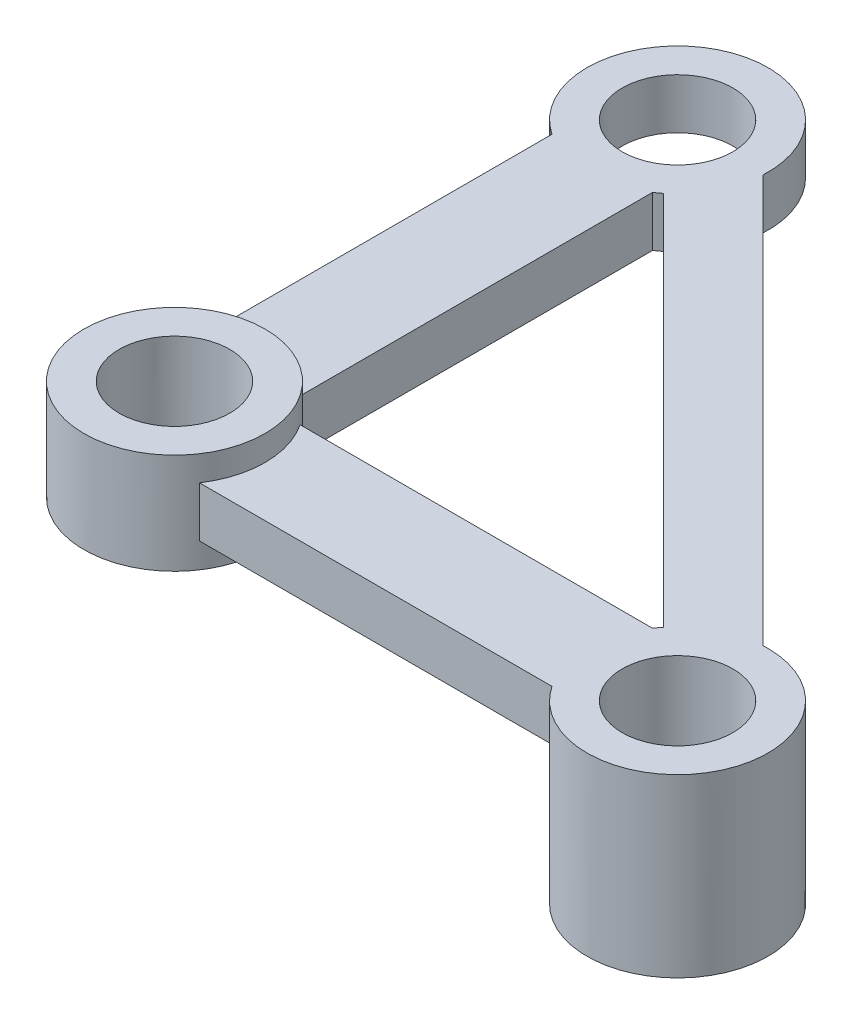
ISO-10303-21;
HEADER;
FILE_DESCRIPTION(('STEP AP214'),'2;1');
FILE_NAME('part.step','',(''),(''),'','','');
FILE_SCHEMA(('AUTOMOTIVE_DESIGN { 1 0 10303 214 1 1 1 1 }'));
ENDSEC;
DATA;
#1=APPLICATION_CONTEXT('core data for automotive mechanical design processes');
#2=APPLICATION_PROTOCOL_DEFINITION('international standard','automotive_design',2000,#1);
#3=PRODUCT_CONTEXT('',#1,'mechanical');
#4=PRODUCT('Part','Part','',(#3));
#5=PRODUCT_RELATED_PRODUCT_CATEGORY('part','',(#4));
#6=PRODUCT_DEFINITION_FORMATION('','',#4);
#7=PRODUCT_DEFINITION_CONTEXT('part definition',#1,'design');
#8=PRODUCT_DEFINITION('design','',#6,#7);
#9=PRODUCT_DEFINITION_SHAPE('','',#8);
#10=(LENGTH_UNIT() NAMED_UNIT(*) SI_UNIT(.MILLI.,.METRE.));
#11=(NAMED_UNIT(*) PLANE_ANGLE_UNIT() SI_UNIT($,.RADIAN.));
#12=(NAMED_UNIT(*) SI_UNIT($,.STERADIAN.) SOLID_ANGLE_UNIT());
#13=UNCERTAINTY_MEASURE_WITH_UNIT(LENGTH_MEASURE(1.E-05),#10,'distance_accuracy_value','');
#14=(GEOMETRIC_REPRESENTATION_CONTEXT(3) GLOBAL_UNCERTAINTY_ASSIGNED_CONTEXT((#13)) GLOBAL_UNIT_ASSIGNED_CONTEXT((#10,
#11,#12)) REPRESENTATION_CONTEXT('',''));
#15=CARTESIAN_POINT('',(0.,0.,0.));
#16=DIRECTION('',(0.,0.,1.));
#17=DIRECTION('',(1.,0.,0.));
#18=AXIS2_PLACEMENT_3D('',#15,#16,#17);
#19=CARTESIAN_POINT('',(0.,0.,50.));
#20=DIRECTION('',(0.,1.,0.));
#21=DIRECTION('',(0.,0.,1.));
#22=AXIS2_PLACEMENT_3D('',#19,#20,#21);
#23=PLANE('',#22);
#24=CARTESIAN_POINT('',(0.,0.,0.));
#25=DIRECTION('',(0.,1.,0.));
#26=DIRECTION('',(0.,0.,1.));
#27=AXIS2_PLACEMENT_3D('',#24,#25,#26);
#28=CIRCLE('',#27,5.5);
#29=CARTESIAN_POINT('',(0.,0.,5.5));
#30=VERTEX_POINT('',#29);
#31=EDGE_CURVE('E187',#30,#30,#28,.T.);
#32=ORIENTED_EDGE('',*,*,#31,.T.);
#33=EDGE_LOOP('',(#32));
#34=FACE_BOUND('',#33,.T.);
#35=CARTESIAN_POINT('',(0.,0.,50.));
#36=DIRECTION('',(0.,-1.,0.));
#37=DIRECTION('',(0.,0.,-1.));
#38=AXIS2_PLACEMENT_3D('',#35,#36,#37);
#39=CIRCLE('',#38,9.);
#40=CARTESIAN_POINT('',(-5.00000000000001,0.,42.5166852264521));
#41=VERTEX_POINT('',#40);
#42=CARTESIAN_POINT('',(5.00000000000001,0.,42.5166852264521));
#43=VERTEX_POINT('',#42);
#44=EDGE_CURVE('E98',#41,#43,#39,.T.);
#45=ORIENTED_EDGE('',*,*,#44,.F.);
#46=DIRECTION('',(0.,0.,1.));
#47=VECTOR('',#46,1.);
#48=CARTESIAN_POINT('',(-5.,0.,7.48331477354788));
#49=LINE('',#48,#47);
#50=CARTESIAN_POINT('',(-5.,0.,7.48331477354788));
#51=VERTEX_POINT('',#50);
#52=EDGE_CURVE('E158',#51,#41,#49,.T.);
#53=ORIENTED_EDGE('',*,*,#52,.F.);
#54=CARTESIAN_POINT('',(0.,0.,0.));
#55=DIRECTION('',(0.,1.,0.));
#56=DIRECTION('',(0.,0.,1.));
#57=AXIS2_PLACEMENT_3D('',#54,#55,#56);
#58=CIRCLE('',#57,9.);
#59=CARTESIAN_POINT('',(8.98605717737185,0.,0.500775803133288));
#60=VERTEX_POINT('',#59);
#61=EDGE_CURVE('E155',#60,#51,#58,.T.);
#62=ORIENTED_EDGE('',*,*,#61,.F.);
#63=DIRECTION('',(-0.707106781186547,0.,-0.707106781186548));
#64=VECTOR('',#63,1.);
#65=CARTESIAN_POINT('',(8.98605717737185,0.,0.500775803133289));
#66=LINE('',#65,#64);
#67=CARTESIAN_POINT('',(49.4992241968666,0.,41.0139428226281));
#68=VERTEX_POINT('',#67);
#69=EDGE_CURVE('E132',#68,#60,#66,.T.);
#70=ORIENTED_EDGE('',*,*,#69,.F.);
#71=CARTESIAN_POINT('',(50.,0.,50.));
#72=DIRECTION('',(0.,-1.,0.));
#73=DIRECTION('',(0.,0.,-1.));
#74=AXIS2_PLACEMENT_3D('',#71,#72,#73);
#75=CIRCLE('',#74,9.);
#76=CARTESIAN_POINT('',(42.9683378984767,0.,44.3825514608498));
#77=VERTEX_POINT('',#76);
#78=EDGE_CURVE('E55',#77,#68,#75,.T.);
#79=ORIENTED_EDGE('',*,*,#78,.F.);
#80=DIRECTION('',(-0.707106781186547,0.,-0.707106781186548));
#81=VECTOR('',#80,1.);
#82=CARTESIAN_POINT('',(5.6174485391502,0.,7.03166210152331));
#83=LINE('',#82,#81);
#84=CARTESIAN_POINT('',(5.6174485391502,0.,7.03166210152331));
#85=VERTEX_POINT('',#84);
#86=EDGE_CURVE('E195',#77,#85,#83,.T.);
#87=ORIENTED_EDGE('',*,*,#86,.T.);
#88=CARTESIAN_POINT('',(0.,0.,0.));
#89=DIRECTION('',(0.,-1.,0.));
#90=DIRECTION('',(0.,0.,1.));
#91=AXIS2_PLACEMENT_3D('',#88,#89,#90);
#92=CIRCLE('',#91,9.);
#93=CARTESIAN_POINT('',(5.,0.,7.48331477354788));
#94=VERTEX_POINT('',#93);
#95=EDGE_CURVE('E293',#85,#94,#92,.T.);
#96=ORIENTED_EDGE('',*,*,#95,.T.);
#97=DIRECTION('',(0.,0.,1.));
#98=VECTOR('',#97,1.);
#99=CARTESIAN_POINT('',(5.,0.,7.48331477354788));
#100=LINE('',#99,#98);
#101=EDGE_CURVE('E287',#94,#43,#100,.T.);
#102=ORIENTED_EDGE('',*,*,#101,.T.);
#103=EDGE_LOOP('',(#45,#53,#62,#70,#79,#87,#96,#102));
#104=FACE_BOUND('',#103,.T.);
#105=ADVANCED_FACE('F45',(#34,#104),#23,.F.);
#106=CARTESIAN_POINT('',(7.48331477354788,0.,45.));
#107=VERTEX_POINT('',#106);
#108=CARTESIAN_POINT('',(7.48331477354788,0.,55.));
#109=VERTEX_POINT('',#108);
#110=EDGE_CURVE('E208',#107,#109,#39,.T.);
#111=ORIENTED_EDGE('',*,*,#110,.F.);
#112=DIRECTION('',(1.,0.,0.));
#113=VECTOR('',#112,1.);
#114=CARTESIAN_POINT('',(7.48331477354788,0.,45.));
#115=LINE('',#114,#113);
#116=CARTESIAN_POINT('',(42.5166852264521,0.,45.));
#117=VERTEX_POINT('',#116);
#118=EDGE_CURVE('E282',#107,#117,#115,.T.);
#119=ORIENTED_EDGE('',*,*,#118,.T.);
#120=CARTESIAN_POINT('',(42.5166852264521,0.,55.));
#121=VERTEX_POINT('',#120);
#122=EDGE_CURVE('E180',#121,#117,#75,.T.);
#123=ORIENTED_EDGE('',*,*,#122,.F.);
#124=DIRECTION('',(1.,0.,0.));
#125=VECTOR('',#124,1.);
#126=CARTESIAN_POINT('',(7.48331477354788,0.,55.));
#127=LINE('',#126,#125);
#128=EDGE_CURVE('E148',#109,#121,#127,.T.);
#129=ORIENTED_EDGE('',*,*,#128,.F.);
#130=EDGE_LOOP('',(#111,#119,#123,#129));
#131=FACE_BOUND('',#130,.T.);
#132=ADVANCED_FACE('F246',(#131),#23,.F.);
#133=CARTESIAN_POINT('',(0.,5.,50.));
#134=DIRECTION('',(0.,1.,0.));
#135=DIRECTION('',(0.,0.,1.));
#136=AXIS2_PLACEMENT_3D('',#133,#134,#135);
#137=PLANE('',#136);
#138=CARTESIAN_POINT('',(50.,5.,50.));
#139=DIRECTION('',(0.,1.,0.));
#140=DIRECTION('',(0.,0.,1.));
#141=AXIS2_PLACEMENT_3D('',#138,#139,#140);
#142=CIRCLE('',#141,5.5);
#143=CARTESIAN_POINT('',(50.,5.,55.5));
#144=VERTEX_POINT('',#143);
#145=EDGE_CURVE('E227',#144,#144,#142,.T.);
#146=ORIENTED_EDGE('',*,*,#145,.F.);
#147=EDGE_LOOP('',(#146));
#148=FACE_BOUND('',#147,.T.);
#149=CARTESIAN_POINT('',(0.,5.,50.));
#150=DIRECTION('',(0.,1.,0.));
#151=DIRECTION('',(0.,0.,1.));
#152=AXIS2_PLACEMENT_3D('',#149,#150,#151);
#153=CIRCLE('',#152,8.99999999999999);
#154=CARTESIAN_POINT('',(7.48331477354788,5.,55.));
#155=VERTEX_POINT('',#154);
#156=CARTESIAN_POINT('',(7.48331477354788,5.,45.));
#157=VERTEX_POINT('',#156);
#158=EDGE_CURVE('E57',#155,#157,#153,.T.);
#159=ORIENTED_EDGE('',*,*,#158,.F.);
#160=DIRECTION('',(1.,0.,0.));
#161=VECTOR('',#160,1.);
#162=CARTESIAN_POINT('',(7.48331477354788,5.,55.));
#163=LINE('',#162,#161);
#164=CARTESIAN_POINT('',(42.5166852264521,5.,55.));
#165=VERTEX_POINT('',#164);
#166=EDGE_CURVE('E106',#155,#165,#163,.T.);
#167=ORIENTED_EDGE('',*,*,#166,.T.);
#168=CARTESIAN_POINT('',(50.,5.,50.));
#169=DIRECTION('',(0.,1.,0.));
#170=DIRECTION('',(0.,0.,1.));
#171=AXIS2_PLACEMENT_3D('',#168,#169,#170);
#172=CIRCLE('',#171,9.00000000000001);
#173=CARTESIAN_POINT('',(49.4992241968666,5.,41.0139428226281));
#174=VERTEX_POINT('',#173);
#175=EDGE_CURVE('E122',#165,#174,#172,.T.);
#176=ORIENTED_EDGE('',*,*,#175,.T.);
#177=DIRECTION('',(-0.707106781186547,0.,-0.707106781186548));
#178=VECTOR('',#177,1.);
#179=CARTESIAN_POINT('',(8.98605717737185,5.,0.500775803133289));
#180=LINE('',#179,#178);
#181=CARTESIAN_POINT('',(8.98605717737185,5.,0.500775803133288));
#182=VERTEX_POINT('',#181);
#183=EDGE_CURVE('E114',#174,#182,#180,.T.);
#184=ORIENTED_EDGE('',*,*,#183,.T.);
#185=CARTESIAN_POINT('',(0.,5.,0.));
#186=DIRECTION('',(0.,1.,0.));
#187=DIRECTION('',(0.,0.,1.));
#188=AXIS2_PLACEMENT_3D('',#185,#186,#187);
#189=CIRCLE('',#188,9.);
#190=CARTESIAN_POINT('',(-5.,5.,7.48331477354788));
#191=VERTEX_POINT('',#190);
#192=EDGE_CURVE('E119',#182,#191,#189,.T.);
#193=ORIENTED_EDGE('',*,*,#192,.T.);
#194=DIRECTION('',(0.,0.,1.));
#195=VECTOR('',#194,1.);
#196=CARTESIAN_POINT('',(-5.,5.,7.48331477354788));
#197=LINE('',#196,#195);
#198=CARTESIAN_POINT('',(-5.00000000000001,5.,42.5166852264521));
#199=VERTEX_POINT('',#198);
#200=EDGE_CURVE('E73',#191,#199,#197,.T.);
#201=ORIENTED_EDGE('',*,*,#200,.T.);
#202=CARTESIAN_POINT('',(5.00000000000001,5.,42.5166852264521));
#203=VERTEX_POINT('',#202);
#204=EDGE_CURVE('E11',#203,#199,#153,.T.);
#205=ORIENTED_EDGE('',*,*,#204,.F.);
#206=DIRECTION('',(0.,0.,1.));
#207=VECTOR('',#206,1.);
#208=CARTESIAN_POINT('',(5.,5.,7.48331477354788));
#209=LINE('',#208,#207);
#210=CARTESIAN_POINT('',(5.,5.,7.48331477354788));
#211=VERTEX_POINT('',#210);
#212=EDGE_CURVE('E321',#211,#203,#209,.T.);
#213=ORIENTED_EDGE('',*,*,#212,.F.);
#214=CARTESIAN_POINT('',(0.,5.,0.));
#215=DIRECTION('',(0.,-1.,0.));
#216=DIRECTION('',(0.,0.,1.));
#217=AXIS2_PLACEMENT_3D('',#214,#215,#216);
#218=CIRCLE('',#217,9.);
#219=CARTESIAN_POINT('',(5.6174485391502,5.,7.03166210152331));
#220=VERTEX_POINT('',#219);
#221=EDGE_CURVE('E325',#220,#211,#218,.T.);
#222=ORIENTED_EDGE('',*,*,#221,.F.);
#223=DIRECTION('',(-0.707106781186547,0.,-0.707106781186548));
#224=VECTOR('',#223,1.);
#225=CARTESIAN_POINT('',(5.6174485391502,5.,7.03166210152331));
#226=LINE('',#225,#224);
#227=CARTESIAN_POINT('',(42.9683378984767,5.,44.3825514608498));
#228=VERTEX_POINT('',#227);
#229=EDGE_CURVE('E292',#228,#220,#226,.T.);
#230=ORIENTED_EDGE('',*,*,#229,.F.);
#231=CARTESIAN_POINT('',(50.,5.,50.));
#232=DIRECTION('',(0.,-1.,0.));
#233=DIRECTION('',(0.,0.,1.));
#234=AXIS2_PLACEMENT_3D('',#231,#232,#233);
#235=CIRCLE('',#234,9.);
#236=CARTESIAN_POINT('',(42.5166852264521,5.,45.));
#237=VERTEX_POINT('',#236);
#238=EDGE_CURVE('E286',#237,#228,#235,.T.);
#239=ORIENTED_EDGE('',*,*,#238,.F.);
#240=DIRECTION('',(1.,0.,0.));
#241=VECTOR('',#240,1.);
#242=CARTESIAN_POINT('',(7.48331477354788,5.,45.));
#243=LINE('',#242,#241);
#244=EDGE_CURVE('E300',#157,#237,#243,.T.);
#245=ORIENTED_EDGE('',*,*,#244,.F.);
#246=EDGE_LOOP('',(#159,#167,#176,#184,#193,#201,#205,#213,#222,#230,#239,#245));
#247=FACE_BOUND('',#246,.T.);
#248=CARTESIAN_POINT('',(0.,5.,0.));
#249=DIRECTION('',(0.,1.,0.));
#250=DIRECTION('',(0.,0.,1.));
#251=AXIS2_PLACEMENT_3D('',#248,#249,#250);
#252=CIRCLE('',#251,5.5);
#253=CARTESIAN_POINT('',(0.,5.,5.5));
#254=VERTEX_POINT('',#253);
#255=EDGE_CURVE('E197',#254,#254,#252,.T.);
#256=ORIENTED_EDGE('',*,*,#255,.F.);
#257=EDGE_LOOP('',(#256));
#258=FACE_BOUND('',#257,.T.);
#259=ADVANCED_FACE('F116',(#148,#247,#258),#137,.T.);
#260=CARTESIAN_POINT('',(0.,5.,50.));
#261=DIRECTION('',(0.,-1.,0.));
#262=DIRECTION('',(0.,0.,-1.));
#263=AXIS2_PLACEMENT_3D('',#260,#261,#262);
#264=CYLINDRICAL_SURFACE('',#263,9.);
#265=ORIENTED_EDGE('',*,*,#158,.T.);
#266=DIRECTION('',(0.,-1.,0.));
#267=VECTOR('',#266,1.);
#268=CARTESIAN_POINT('',(7.48331477354788,5.,45.));
#269=LINE('',#268,#267);
#270=EDGE_CURVE('E64',#157,#107,#269,.T.);
#271=ORIENTED_EDGE('',*,*,#270,.T.);
#272=ORIENTED_EDGE('',*,*,#110,.T.);
#273=DIRECTION('',(0.,-1.,0.));
#274=VECTOR('',#273,1.);
#275=CARTESIAN_POINT('',(7.48331477354788,5.,55.));
#276=LINE('',#275,#274);
#277=EDGE_CURVE('E49',#155,#109,#276,.T.);
#278=ORIENTED_EDGE('',*,*,#277,.F.);
#279=EDGE_LOOP('',(#265,#271,#272,#278));
#280=FACE_BOUND('',#279,.T.);
#281=DIRECTION('',(0.,-1.,0.));
#282=VECTOR('',#281,1.);
#283=CARTESIAN_POINT('',(-5.00000000000001,5.,42.5166852264521));
#284=LINE('',#283,#282);
#285=EDGE_CURVE('E144',#199,#41,#284,.T.);
#286=ORIENTED_EDGE('',*,*,#285,.T.);
#287=ORIENTED_EDGE('',*,*,#44,.T.);
#288=DIRECTION('',(0.,-1.,0.));
#289=VECTOR('',#288,1.);
#290=CARTESIAN_POINT('',(5.00000000000001,5.,42.5166852264521));
#291=LINE('',#290,#289);
#292=EDGE_CURVE('E303',#203,#43,#291,.T.);
#293=ORIENTED_EDGE('',*,*,#292,.F.);
#294=ORIENTED_EDGE('',*,*,#204,.T.);
#295=EDGE_LOOP('',(#286,#287,#293,#294));
#296=FACE_BOUND('',#295,.T.);
#297=CARTESIAN_POINT('',(0.,-2.5,50.));
#298=DIRECTION('',(0.,-1.,0.));
#299=DIRECTION('',(0.,0.,-1.));
#300=AXIS2_PLACEMENT_3D('',#297,#298,#299);
#301=CIRCLE('',#300,9.);
#302=CARTESIAN_POINT('',(0.,-2.5,41.));
#303=VERTEX_POINT('',#302);
#304=EDGE_CURVE('E203',#303,#303,#301,.T.);
#305=ORIENTED_EDGE('',*,*,#304,.F.);
#306=EDGE_LOOP('',(#305));
#307=FACE_BOUND('',#306,.T.);
#308=CARTESIAN_POINT('',(0.,7.5,50.));
#309=DIRECTION('',(0.,1.,0.));
#310=DIRECTION('',(0.,0.,1.));
#311=AXIS2_PLACEMENT_3D('',#308,#309,#310);
#312=CIRCLE('',#311,8.99999999999999);
#313=CARTESIAN_POINT('',(0.,7.5,59.));
#314=VERTEX_POINT('',#313);
#315=EDGE_CURVE('E209',#314,#314,#312,.T.);
#316=ORIENTED_EDGE('',*,*,#315,.F.);
#317=EDGE_LOOP('',(#316));
#318=FACE_BOUND('',#317,.T.);
#319=ADVANCED_FACE('F47',(#280,#296,#307,#318),#264,.T.);
#320=CARTESIAN_POINT('',(7.48331477354788,5.,55.));
#321=DIRECTION('',(0.,0.,-1.));
#322=DIRECTION('',(-1.,0.,0.));
#323=AXIS2_PLACEMENT_3D('',#320,#321,#322);
#324=PLANE('',#323);
#325=ORIENTED_EDGE('',*,*,#128,.T.);
#326=DIRECTION('',(0.,-1.,0.));
#327=VECTOR('',#326,1.);
#328=CARTESIAN_POINT('',(42.5166852264521,5.,55.));
#329=LINE('',#328,#327);
#330=EDGE_CURVE('E167',#165,#121,#329,.T.);
#331=ORIENTED_EDGE('',*,*,#330,.F.);
#332=ORIENTED_EDGE('',*,*,#166,.F.);
#333=ORIENTED_EDGE('',*,*,#277,.T.);
#334=EDGE_LOOP('',(#325,#331,#332,#333));
#335=FACE_BOUND('',#334,.T.);
#336=ADVANCED_FACE('F253',(#335),#324,.F.);
#337=CARTESIAN_POINT('',(50.,5.,50.));
#338=DIRECTION('',(0.,-1.,0.));
#339=DIRECTION('',(0.,0.,-1.));
#340=AXIS2_PLACEMENT_3D('',#337,#338,#339);
#341=CYLINDRICAL_SURFACE('',#340,9.00000000000001);
#342=ORIENTED_EDGE('',*,*,#330,.T.);
#343=ORIENTED_EDGE('',*,*,#122,.T.);
#344=DIRECTION('',(0.,-1.,0.));
#345=VECTOR('',#344,1.);
#346=CARTESIAN_POINT('',(42.5166852264521,5.,45.));
#347=LINE('',#346,#345);
#348=EDGE_CURVE('E297',#237,#117,#347,.T.);
#349=ORIENTED_EDGE('',*,*,#348,.F.);
#350=ORIENTED_EDGE('',*,*,#238,.T.);
#351=DIRECTION('',(0.,-1.,0.));
#352=VECTOR('',#351,1.);
#353=CARTESIAN_POINT('',(42.9683378984767,5.,44.3825514608498));
#354=LINE('',#353,#352);
#355=EDGE_CURVE('E152',#228,#77,#354,.T.);
#356=ORIENTED_EDGE('',*,*,#355,.T.);
#357=ORIENTED_EDGE('',*,*,#78,.T.);
#358=DIRECTION('',(0.,-1.,0.));
#359=VECTOR('',#358,1.);
#360=CARTESIAN_POINT('',(49.4992241968666,5.,41.0139428226281));
#361=LINE('',#360,#359);
#362=EDGE_CURVE('E136',#174,#68,#361,.T.);
#363=ORIENTED_EDGE('',*,*,#362,.F.);
#364=ORIENTED_EDGE('',*,*,#175,.F.);
#365=EDGE_LOOP('',(#342,#343,#349,#350,#356,#357,#363,#364));
#366=FACE_BOUND('',#365,.T.);
#367=CARTESIAN_POINT('',(50.,-12.5,50.));
#368=DIRECTION('',(0.,-1.,0.));
#369=DIRECTION('',(0.,0.,-1.));
#370=AXIS2_PLACEMENT_3D('',#367,#368,#369);
#371=CIRCLE('',#370,9.);
#372=CARTESIAN_POINT('',(50.,-12.5,41.));
#373=VERTEX_POINT('',#372);
#374=EDGE_CURVE('E186',#373,#373,#371,.T.);
#375=ORIENTED_EDGE('',*,*,#374,.F.);
#376=EDGE_LOOP('',(#375));
#377=FACE_BOUND('',#376,.T.);
#378=ADVANCED_FACE('F273',(#366,#377),#341,.T.);
#379=CARTESIAN_POINT('',(8.98605717737185,5.,0.500775803133289));
#380=DIRECTION('',(-0.707106781186548,0.,0.707106781186547));
#381=DIRECTION('',(0.707106781186547,0.,0.707106781186548));
#382=AXIS2_PLACEMENT_3D('',#379,#380,#381);
#383=PLANE('',#382);
#384=ORIENTED_EDGE('',*,*,#69,.T.);
#385=DIRECTION('',(0.,-1.,0.));
#386=VECTOR('',#385,1.);
#387=CARTESIAN_POINT('',(8.98605717737185,5.,0.500775803133288));
#388=LINE('',#387,#386);
#389=EDGE_CURVE('E129',#182,#60,#388,.T.);
#390=ORIENTED_EDGE('',*,*,#389,.F.);
#391=ORIENTED_EDGE('',*,*,#183,.F.);
#392=ORIENTED_EDGE('',*,*,#362,.T.);
#393=EDGE_LOOP('',(#384,#390,#391,#392));
#394=FACE_BOUND('',#393,.T.);
#395=ADVANCED_FACE('F130',(#394),#383,.F.);
#396=CARTESIAN_POINT('',(0.,5.,0.));
#397=DIRECTION('',(0.,-1.,0.));
#398=DIRECTION('',(0.,0.,-1.));
#399=AXIS2_PLACEMENT_3D('',#396,#397,#398);
#400=CYLINDRICAL_SURFACE('',#399,9.);
#401=ORIENTED_EDGE('',*,*,#61,.T.);
#402=DIRECTION('',(0.,-1.,0.));
#403=VECTOR('',#402,1.);
#404=CARTESIAN_POINT('',(-5.,5.,7.48331477354788));
#405=LINE('',#404,#403);
#406=EDGE_CURVE('E137',#191,#51,#405,.T.);
#407=ORIENTED_EDGE('',*,*,#406,.F.);
#408=ORIENTED_EDGE('',*,*,#192,.F.);
#409=ORIENTED_EDGE('',*,*,#389,.T.);
#410=EDGE_LOOP('',(#401,#407,#408,#409));
#411=FACE_BOUND('',#410,.T.);
#412=ADVANCED_FACE('F139',(#411),#400,.T.);
#413=CARTESIAN_POINT('',(-5.,5.,7.48331477354788));
#414=DIRECTION('',(1.,0.,0.));
#415=DIRECTION('',(0.,0.,-1.));
#416=AXIS2_PLACEMENT_3D('',#413,#414,#415);
#417=PLANE('',#416);
#418=ORIENTED_EDGE('',*,*,#52,.T.);
#419=ORIENTED_EDGE('',*,*,#285,.F.);
#420=ORIENTED_EDGE('',*,*,#200,.F.);
#421=ORIENTED_EDGE('',*,*,#406,.T.);
#422=EDGE_LOOP('',(#418,#419,#420,#421));
#423=FACE_BOUND('',#422,.T.);
#424=ADVANCED_FACE('F264',(#423),#417,.F.);
#425=CARTESIAN_POINT('',(5.6174485391502,5.,7.03166210152331));
#426=DIRECTION('',(-0.707106781186548,0.,0.707106781186547));
#427=DIRECTION('',(0.707106781186547,0.,0.707106781186548));
#428=AXIS2_PLACEMENT_3D('',#425,#426,#427);
#429=PLANE('',#428);
#430=ORIENTED_EDGE('',*,*,#86,.F.);
#431=ORIENTED_EDGE('',*,*,#355,.F.);
#432=ORIENTED_EDGE('',*,*,#229,.T.);
#433=DIRECTION('',(0.,-1.,0.));
#434=VECTOR('',#433,1.);
#435=CARTESIAN_POINT('',(5.6174485391502,5.,7.03166210152331));
#436=LINE('',#435,#434);
#437=EDGE_CURVE('E311',#220,#85,#436,.T.);
#438=ORIENTED_EDGE('',*,*,#437,.T.);
#439=EDGE_LOOP('',(#430,#431,#432,#438));
#440=FACE_BOUND('',#439,.T.);
#441=ADVANCED_FACE('F267',(#440),#429,.T.);
#442=CARTESIAN_POINT('',(0.,5.,0.));
#443=DIRECTION('',(0.,-1.,0.));
#444=DIRECTION('',(0.,0.,-1.));
#445=AXIS2_PLACEMENT_3D('',#442,#443,#444);
#446=CYLINDRICAL_SURFACE('',#445,9.);
#447=ORIENTED_EDGE('',*,*,#95,.F.);
#448=ORIENTED_EDGE('',*,*,#437,.F.);
#449=ORIENTED_EDGE('',*,*,#221,.T.);
#450=DIRECTION('',(0.,-1.,0.));
#451=VECTOR('',#450,1.);
#452=CARTESIAN_POINT('',(5.,5.,7.48331477354788));
#453=LINE('',#452,#451);
#454=EDGE_CURVE('E307',#211,#94,#453,.T.);
#455=ORIENTED_EDGE('',*,*,#454,.T.);
#456=EDGE_LOOP('',(#447,#448,#449,#455));
#457=FACE_BOUND('',#456,.T.);
#458=ADVANCED_FACE('F348',(#457),#446,.T.);
#459=CARTESIAN_POINT('',(5.,5.,7.48331477354788));
#460=DIRECTION('',(1.,0.,0.));
#461=DIRECTION('',(0.,0.,-1.));
#462=AXIS2_PLACEMENT_3D('',#459,#460,#461);
#463=PLANE('',#462);
#464=ORIENTED_EDGE('',*,*,#101,.F.);
#465=ORIENTED_EDGE('',*,*,#454,.F.);
#466=ORIENTED_EDGE('',*,*,#212,.T.);
#467=ORIENTED_EDGE('',*,*,#292,.T.);
#468=EDGE_LOOP('',(#464,#465,#466,#467));
#469=FACE_BOUND('',#468,.T.);
#470=ADVANCED_FACE('F370',(#469),#463,.T.);
#471=CARTESIAN_POINT('',(7.48331477354788,5.,45.));
#472=DIRECTION('',(0.,0.,-1.));
#473=DIRECTION('',(-1.,0.,0.));
#474=AXIS2_PLACEMENT_3D('',#471,#472,#473);
#475=PLANE('',#474);
#476=ORIENTED_EDGE('',*,*,#118,.F.);
#477=ORIENTED_EDGE('',*,*,#270,.F.);
#478=ORIENTED_EDGE('',*,*,#244,.T.);
#479=ORIENTED_EDGE('',*,*,#348,.T.);
#480=EDGE_LOOP('',(#476,#477,#478,#479));
#481=FACE_BOUND('',#480,.T.);
#482=ADVANCED_FACE('F366',(#481),#475,.T.);
#483=CARTESIAN_POINT('',(50.,-12.5,50.));
#484=DIRECTION('',(0.,-1.,0.));
#485=DIRECTION('',(0.,0.,-1.));
#486=AXIS2_PLACEMENT_3D('',#483,#484,#485);
#487=PLANE('',#486);
#488=CARTESIAN_POINT('',(50.,-12.5,50.));
#489=DIRECTION('',(0.,1.,0.));
#490=DIRECTION('',(0.,0.,1.));
#491=AXIS2_PLACEMENT_3D('',#488,#489,#490);
#492=CIRCLE('',#491,5.5);
#493=CARTESIAN_POINT('',(50.,-12.5,55.5));
#494=VERTEX_POINT('',#493);
#495=EDGE_CURVE('E226',#494,#494,#492,.T.);
#496=ORIENTED_EDGE('',*,*,#495,.T.);
#497=EDGE_LOOP('',(#496));
#498=FACE_BOUND('',#497,.T.);
#499=ORIENTED_EDGE('',*,*,#374,.T.);
#500=EDGE_LOOP('',(#499));
#501=FACE_BOUND('',#500,.T.);
#502=ADVANCED_FACE('F235',(#498,#501),#487,.T.);
#503=CARTESIAN_POINT('',(0.,0.,0.));
#504=DIRECTION('',(0.,1.,0.));
#505=DIRECTION('',(0.,0.,1.));
#506=AXIS2_PLACEMENT_3D('',#503,#504,#505);
#507=CYLINDRICAL_SURFACE('',#506,5.5);
#508=ORIENTED_EDGE('',*,*,#31,.F.);
#509=EDGE_LOOP('',(#508));
#510=FACE_BOUND('',#509,.T.);
#511=ORIENTED_EDGE('',*,*,#255,.T.);
#512=EDGE_LOOP('',(#511));
#513=FACE_BOUND('',#512,.T.);
#514=ADVANCED_FACE('F387',(#510,#513),#507,.F.);
#515=CARTESIAN_POINT('',(0.,-2.5,50.));
#516=DIRECTION('',(0.,-1.,0.));
#517=DIRECTION('',(0.,0.,-1.));
#518=AXIS2_PLACEMENT_3D('',#515,#516,#517);
#519=PLANE('',#518);
#520=CARTESIAN_POINT('',(0.,-2.5,50.));
#521=DIRECTION('',(0.,-1.,0.));
#522=DIRECTION('',(0.,0.,-1.));
#523=AXIS2_PLACEMENT_3D('',#520,#521,#522);
#524=CIRCLE('',#523,5.5);
#525=CARTESIAN_POINT('',(0.,-2.5,44.5));
#526=VERTEX_POINT('',#525);
#527=EDGE_CURVE('E215',#526,#526,#524,.T.);
#528=ORIENTED_EDGE('',*,*,#527,.F.);
#529=EDGE_LOOP('',(#528));
#530=FACE_BOUND('',#529,.T.);
#531=ORIENTED_EDGE('',*,*,#304,.T.);
#532=EDGE_LOOP('',(#531));
#533=FACE_BOUND('',#532,.T.);
#534=ADVANCED_FACE('F379',(#530,#533),#519,.T.);
#535=CARTESIAN_POINT('',(0.,7.5,50.));
#536=DIRECTION('',(0.,1.,0.));
#537=DIRECTION('',(0.,0.,1.));
#538=AXIS2_PLACEMENT_3D('',#535,#536,#537);
#539=PLANE('',#538);
#540=CARTESIAN_POINT('',(0.,7.5,50.));
#541=DIRECTION('',(0.,1.,0.));
#542=DIRECTION('',(0.,0.,1.));
#543=AXIS2_PLACEMENT_3D('',#540,#541,#542);
#544=CIRCLE('',#543,5.5);
#545=CARTESIAN_POINT('',(0.,7.5,55.5));
#546=VERTEX_POINT('',#545);
#547=EDGE_CURVE('E222',#546,#546,#544,.T.);
#548=ORIENTED_EDGE('',*,*,#547,.F.);
#549=EDGE_LOOP('',(#548));
#550=FACE_BOUND('',#549,.T.);
#551=ORIENTED_EDGE('',*,*,#315,.T.);
#552=EDGE_LOOP('',(#551));
#553=FACE_BOUND('',#552,.T.);
#554=ADVANCED_FACE('F377',(#550,#553),#539,.T.);
#555=CARTESIAN_POINT('',(0.,-12.5,50.));
#556=DIRECTION('',(0.,1.,0.));
#557=DIRECTION('',(0.,0.,1.));
#558=AXIS2_PLACEMENT_3D('',#555,#556,#557);
#559=CYLINDRICAL_SURFACE('',#558,5.5);
#560=ORIENTED_EDGE('',*,*,#527,.T.);
#561=EDGE_LOOP('',(#560));
#562=FACE_BOUND('',#561,.T.);
#563=ORIENTED_EDGE('',*,*,#547,.T.);
#564=EDGE_LOOP('',(#563));
#565=FACE_BOUND('',#564,.T.);
#566=ADVANCED_FACE('F241',(#562,#565),#559,.F.);
#567=CARTESIAN_POINT('',(50.,-12.5,50.));
#568=DIRECTION('',(0.,1.,0.));
#569=DIRECTION('',(0.,0.,1.));
#570=AXIS2_PLACEMENT_3D('',#567,#568,#569);
#571=CYLINDRICAL_SURFACE('',#570,5.5);
#572=ORIENTED_EDGE('',*,*,#495,.F.);
#573=EDGE_LOOP('',(#572));
#574=FACE_BOUND('',#573,.T.);
#575=ORIENTED_EDGE('',*,*,#145,.T.);
#576=EDGE_LOOP('',(#575));
#577=FACE_BOUND('',#576,.T.);
#578=ADVANCED_FACE('F238',(#574,#577),#571,.F.);
#579=CLOSED_SHELL('',(#105,#132,#259,#319,#336,#378,#395,#412,#424,#441,#458,#470,#482,#502,
#514,#534,#554,#566,#578));
#580=MANIFOLD_SOLID_BREP('B2',#579);
#581=ADVANCED_BREP_SHAPE_REPRESENTATION('',(#18,#580),#14);
#582=SHAPE_DEFINITION_REPRESENTATION(#9,#581);
ENDSEC;
END-ISO-10303-21;
